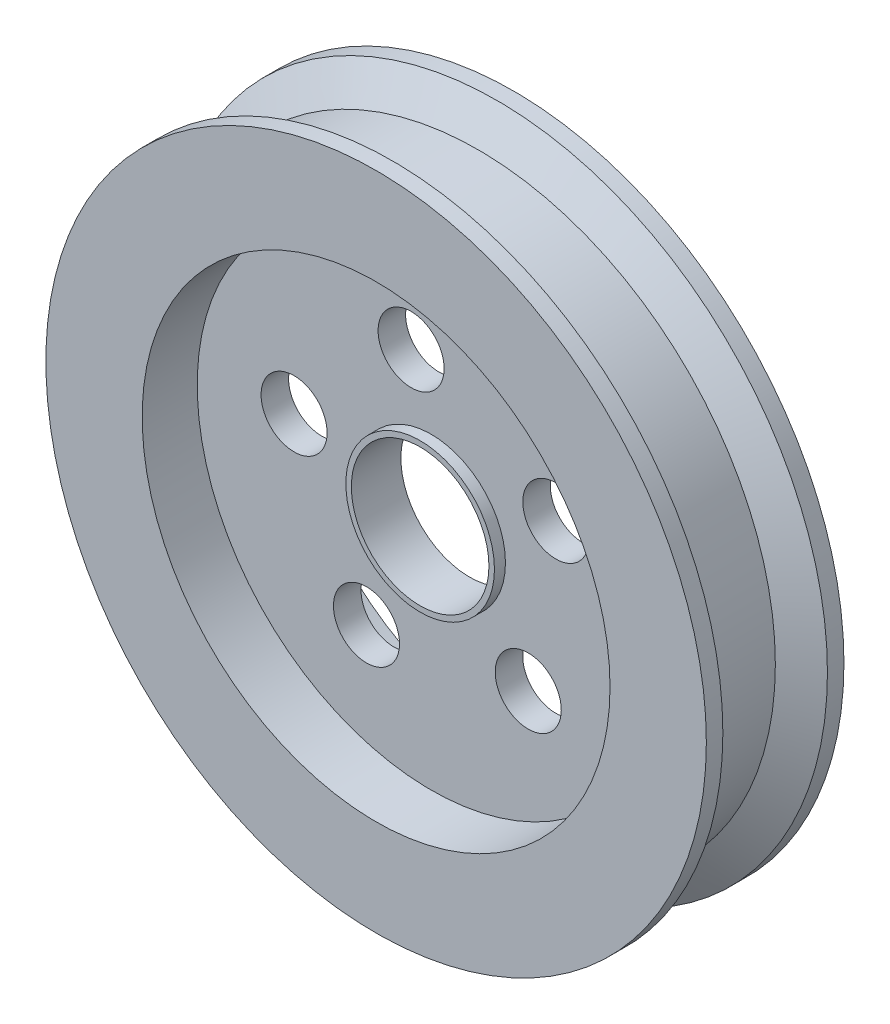
ISO-10303-21;
HEADER;
FILE_DESCRIPTION(('STEP AP214'),'2;1');
FILE_NAME('part.step','',(''),(''),'','','');
FILE_SCHEMA(('AUTOMOTIVE_DESIGN { 1 0 10303 214 1 1 1 1 }'));
ENDSEC;
DATA;
#1=APPLICATION_CONTEXT('core data for automotive mechanical design processes');
#2=APPLICATION_PROTOCOL_DEFINITION('international standard','automotive_design',2000,#1);
#3=PRODUCT_CONTEXT('',#1,'mechanical');
#4=PRODUCT('Part','Part','',(#3));
#5=PRODUCT_RELATED_PRODUCT_CATEGORY('part','',(#4));
#6=PRODUCT_DEFINITION_FORMATION('','',#4);
#7=PRODUCT_DEFINITION_CONTEXT('part definition',#1,'design');
#8=PRODUCT_DEFINITION('design','',#6,#7);
#9=PRODUCT_DEFINITION_SHAPE('','',#8);
#10=(LENGTH_UNIT() NAMED_UNIT(*) SI_UNIT(.MILLI.,.METRE.));
#11=(NAMED_UNIT(*) PLANE_ANGLE_UNIT() SI_UNIT($,.RADIAN.));
#12=(NAMED_UNIT(*) SI_UNIT($,.STERADIAN.) SOLID_ANGLE_UNIT());
#13=UNCERTAINTY_MEASURE_WITH_UNIT(LENGTH_MEASURE(1.E-05),#10,'distance_accuracy_value','');
#14=(GEOMETRIC_REPRESENTATION_CONTEXT(3) GLOBAL_UNCERTAINTY_ASSIGNED_CONTEXT((#13)) GLOBAL_UNIT_ASSIGNED_CONTEXT((#10,
#11,#12)) REPRESENTATION_CONTEXT('',''));
#15=CARTESIAN_POINT('',(0.,0.,0.));
#16=DIRECTION('',(0.,0.,1.));
#17=DIRECTION('',(1.,0.,0.));
#18=AXIS2_PLACEMENT_3D('',#15,#16,#17);
#19=CARTESIAN_POINT('',(0.,0.,12.5));
#20=DIRECTION('',(0.,0.,-1.));
#21=DIRECTION('',(-1.,0.,0.));
#22=AXIS2_PLACEMENT_3D('',#19,#20,#21);
#23=CYLINDRICAL_SURFACE('',#22,60.);
#24=CARTESIAN_POINT('',(0.,0.,-12.5));
#25=DIRECTION('',(0.,0.,1.));
#26=DIRECTION('',(1.,0.,0.));
#27=AXIS2_PLACEMENT_3D('',#24,#25,#26);
#28=CIRCLE('',#27,60.);
#29=CARTESIAN_POINT('',(60.,0.,-12.5));
#30=VERTEX_POINT('',#29);
#31=EDGE_CURVE('E89',#30,#30,#28,.T.);
#32=ORIENTED_EDGE('',*,*,#31,.T.);
#33=EDGE_LOOP('',(#32));
#34=FACE_BOUND('',#33,.T.);
#35=CARTESIAN_POINT('',(0.,0.,-9.5));
#36=DIRECTION('',(0.,0.,1.));
#37=DIRECTION('',(1.,0.,0.));
#38=AXIS2_PLACEMENT_3D('',#35,#36,#37);
#39=CIRCLE('',#38,60.);
#40=CARTESIAN_POINT('',(60.,0.,-9.5));
#41=VERTEX_POINT('',#40);
#42=EDGE_CURVE('E56',#41,#41,#39,.T.);
#43=ORIENTED_EDGE('',*,*,#42,.F.);
#44=EDGE_LOOP('',(#43));
#45=FACE_BOUND('',#44,.T.);
#46=ADVANCED_FACE('F31',(#34,#45),#23,.T.);
#47=CARTESIAN_POINT('',(0.,0.,12.5));
#48=DIRECTION('',(0.,0.,1.));
#49=DIRECTION('',(1.,0.,0.));
#50=AXIS2_PLACEMENT_3D('',#47,#48,#49);
#51=CIRCLE('',#50,60.);
#52=CARTESIAN_POINT('',(60.,0.,12.5));
#53=VERTEX_POINT('',#52);
#54=EDGE_CURVE('E42',#53,#53,#51,.T.);
#55=ORIENTED_EDGE('',*,*,#54,.F.);
#56=EDGE_LOOP('',(#55));
#57=FACE_BOUND('',#56,.T.);
#58=CARTESIAN_POINT('',(0.,0.,9.5));
#59=DIRECTION('',(0.,0.,1.));
#60=DIRECTION('',(1.,0.,0.));
#61=AXIS2_PLACEMENT_3D('',#58,#59,#60);
#62=CIRCLE('',#61,60.);
#63=CARTESIAN_POINT('',(60.,0.,9.5));
#64=VERTEX_POINT('',#63);
#65=EDGE_CURVE('E47',#64,#64,#62,.T.);
#66=ORIENTED_EDGE('',*,*,#65,.T.);
#67=EDGE_LOOP('',(#66));
#68=FACE_BOUND('',#67,.T.);
#69=ADVANCED_FACE('F135',(#57,#68),#23,.T.);
#70=CARTESIAN_POINT('',(0.,0.,-12.5));
#71=DIRECTION('',(0.,0.,1.));
#72=DIRECTION('',(1.,0.,0.));
#73=AXIS2_PLACEMENT_3D('',#70,#71,#72);
#74=PLANE('',#73);
#75=ORIENTED_EDGE('',*,*,#31,.F.);
#76=EDGE_LOOP('',(#75));
#77=FACE_BOUND('',#76,.T.);
#78=CARTESIAN_POINT('',(0.,0.,-12.5));
#79=DIRECTION('',(0.,0.,1.));
#80=DIRECTION('',(1.,0.,0.));
#81=AXIS2_PLACEMENT_3D('',#78,#79,#80);
#82=CIRCLE('',#81,42.5);
#83=CARTESIAN_POINT('',(42.5,0.,-12.5));
#84=VERTEX_POINT('',#83);
#85=EDGE_CURVE('E83',#84,#84,#82,.T.);
#86=ORIENTED_EDGE('',*,*,#85,.T.);
#87=EDGE_LOOP('',(#86));
#88=FACE_BOUND('',#87,.T.);
#89=ADVANCED_FACE('F132',(#77,#88),#74,.F.);
#90=CARTESIAN_POINT('',(0.,0.,12.5));
#91=DIRECTION('',(0.,0.,1.));
#92=DIRECTION('',(1.,0.,0.));
#93=AXIS2_PLACEMENT_3D('',#90,#91,#92);
#94=PLANE('',#93);
#95=CARTESIAN_POINT('',(0.,0.,12.5));
#96=DIRECTION('',(0.,0.,1.));
#97=DIRECTION('',(1.,0.,0.));
#98=AXIS2_PLACEMENT_3D('',#95,#96,#97);
#99=CIRCLE('',#98,42.5);
#100=CARTESIAN_POINT('',(42.5,0.,12.5));
#101=VERTEX_POINT('',#100);
#102=EDGE_CURVE('E82',#101,#101,#99,.T.);
#103=ORIENTED_EDGE('',*,*,#102,.F.);
#104=EDGE_LOOP('',(#103));
#105=FACE_BOUND('',#104,.T.);
#106=ORIENTED_EDGE('',*,*,#54,.T.);
#107=EDGE_LOOP('',(#106));
#108=FACE_BOUND('',#107,.T.);
#109=ADVANCED_FACE('F134',(#105,#108),#94,.T.);
#110=CARTESIAN_POINT('',(0.,0.,2.5));
#111=DIRECTION('',(0.,0.,1.));
#112=DIRECTION('',(1.,0.,0.));
#113=AXIS2_PLACEMENT_3D('',#110,#111,#112);
#114=CYLINDRICAL_SURFACE('',#113,42.5);
#115=CARTESIAN_POINT('',(0.,0.,2.5));
#116=DIRECTION('',(0.,0.,1.));
#117=DIRECTION('',(1.,0.,0.));
#118=AXIS2_PLACEMENT_3D('',#115,#116,#117);
#119=CIRCLE('',#118,42.5);
#120=CARTESIAN_POINT('',(42.5,0.,2.5));
#121=VERTEX_POINT('',#120);
#122=EDGE_CURVE('E86',#121,#121,#119,.T.);
#123=ORIENTED_EDGE('',*,*,#122,.F.);
#124=EDGE_LOOP('',(#123));
#125=FACE_BOUND('',#124,.T.);
#126=ORIENTED_EDGE('',*,*,#102,.T.);
#127=EDGE_LOOP('',(#126));
#128=FACE_BOUND('',#127,.T.);
#129=ADVANCED_FACE('F141',(#125,#128),#114,.F.);
#130=CARTESIAN_POINT('',(0.,0.,2.5));
#131=DIRECTION('',(0.,0.,1.));
#132=DIRECTION('',(1.,0.,0.));
#133=AXIS2_PLACEMENT_3D('',#130,#131,#132);
#134=PLANE('',#133);
#135=CARTESIAN_POINT('',(0.,0.,2.5));
#136=DIRECTION('',(0.,0.,1.));
#137=DIRECTION('',(1.,0.,0.));
#138=AXIS2_PLACEMENT_3D('',#135,#136,#137);
#139=CIRCLE('',#138,13.5);
#140=CARTESIAN_POINT('',(13.5,0.,2.5));
#141=VERTEX_POINT('',#140);
#142=EDGE_CURVE('E10',#141,#141,#139,.T.);
#143=ORIENTED_EDGE('',*,*,#142,.F.);
#144=EDGE_LOOP('',(#143));
#145=FACE_BOUND('',#144,.T.);
#146=CARTESIAN_POINT('',(22.6517749592965,11.186704557469,2.5));
#147=DIRECTION('',(0.,0.,1.));
#148=DIRECTION('',(0.309016994374958,-0.95105651629515,0.));
#149=AXIS2_PLACEMENT_3D('',#146,#147,#148);
#150=CIRCLE('',#149,6.);
#151=CARTESIAN_POINT('',(28.6517749592965,11.186704557469,2.5));
#152=VERTEX_POINT('',#151);
#153=EDGE_CURVE('E59',#152,#152,#150,.T.);
#154=ORIENTED_EDGE('',*,*,#153,.F.);
#155=EDGE_LOOP('',(#154));
#156=FACE_BOUND('',#155,.T.);
#157=CARTESIAN_POINT('',(17.638971680429,-18.0862363613808,2.5));
#158=DIRECTION('',(0.,0.,1.));
#159=DIRECTION('',(-0.809016994374942,-0.58778525229248,0.));
#160=AXIS2_PLACEMENT_3D('',#157,#158,#159);
#161=CIRCLE('',#160,6.);
#162=CARTESIAN_POINT('',(23.638971680429,-18.0862363613808,2.5));
#163=VERTEX_POINT('',#162);
#164=EDGE_CURVE('E63',#163,#163,#161,.T.);
#165=ORIENTED_EDGE('',*,*,#164,.F.);
#166=EDGE_LOOP('',(#165));
#167=FACE_BOUND('',#166,.T.);
#168=CARTESIAN_POINT('',(-11.7502909341946,-22.3646133573665,2.5));
#169=DIRECTION('',(0.,0.,1.));
#170=DIRECTION('',(-0.809016994374951,0.587785252292469,0.));
#171=AXIS2_PLACEMENT_3D('',#168,#169,#170);
#172=CIRCLE('',#171,6.);
#173=CARTESIAN_POINT('',(-5.75029093419464,-22.3646133573665,2.5));
#174=VERTEX_POINT('',#173);
#175=EDGE_CURVE('E67',#174,#174,#172,.T.);
#176=ORIENTED_EDGE('',*,*,#175,.F.);
#177=EDGE_LOOP('',(#176));
#178=FACE_BOUND('',#177,.T.);
#179=CARTESIAN_POINT('',(-24.901050855461,4.26414516127857,2.5));
#180=DIRECTION('',(0.,0.,1.));
#181=DIRECTION('',(0.309016994374945,0.951056516295155,0.));
#182=AXIS2_PLACEMENT_3D('',#179,#180,#181);
#183=CIRCLE('',#182,6.);
#184=CARTESIAN_POINT('',(-18.901050855461,4.26414516127857,2.5));
#185=VERTEX_POINT('',#184);
#186=EDGE_CURVE('E71',#185,#185,#183,.T.);
#187=ORIENTED_EDGE('',*,*,#186,.F.);
#188=EDGE_LOOP('',(#187));
#189=FACE_BOUND('',#188,.T.);
#190=CARTESIAN_POINT('',(-3.63940485006978,25.,2.5));
#191=DIRECTION('',(0.,0.,1.));
#192=DIRECTION('',(1.,0.,0.));
#193=AXIS2_PLACEMENT_3D('',#190,#191,#192);
#194=CIRCLE('',#193,6.);
#195=CARTESIAN_POINT('',(2.36059514993022,25.,2.5));
#196=VERTEX_POINT('',#195);
#197=EDGE_CURVE('E75',#196,#196,#194,.T.);
#198=ORIENTED_EDGE('',*,*,#197,.F.);
#199=EDGE_LOOP('',(#198));
#200=FACE_BOUND('',#199,.T.);
#201=ORIENTED_EDGE('',*,*,#122,.T.);
#202=EDGE_LOOP('',(#201));
#203=FACE_BOUND('',#202,.T.);
#204=ADVANCED_FACE('F128',(#145,#156,#167,#178,#189,#200,#203),#134,.T.);
#205=CARTESIAN_POINT('',(0.,0.,-2.5));
#206=DIRECTION('',(0.,0.,-1.));
#207=DIRECTION('',(-1.,0.,0.));
#208=AXIS2_PLACEMENT_3D('',#205,#206,#207);
#209=CYLINDRICAL_SURFACE('',#208,42.5);
#210=CARTESIAN_POINT('',(0.,0.,-2.5));
#211=DIRECTION('',(0.,0.,1.));
#212=DIRECTION('',(1.,0.,0.));
#213=AXIS2_PLACEMENT_3D('',#210,#211,#212);
#214=CIRCLE('',#213,42.5);
#215=CARTESIAN_POINT('',(42.5,0.,-2.5));
#216=VERTEX_POINT('',#215);
#217=EDGE_CURVE('E79',#216,#216,#214,.T.);
#218=ORIENTED_EDGE('',*,*,#217,.T.);
#219=EDGE_LOOP('',(#218));
#220=FACE_BOUND('',#219,.T.);
#221=ORIENTED_EDGE('',*,*,#85,.F.);
#222=EDGE_LOOP('',(#221));
#223=FACE_BOUND('',#222,.T.);
#224=ADVANCED_FACE('F113',(#220,#223),#209,.F.);
#225=CARTESIAN_POINT('',(0.,0.,-2.5));
#226=DIRECTION('',(0.,0.,-1.));
#227=DIRECTION('',(1.,0.,0.));
#228=AXIS2_PLACEMENT_3D('',#225,#226,#227);
#229=PLANE('',#228);
#230=CARTESIAN_POINT('',(0.,0.,-2.5));
#231=DIRECTION('',(0.,0.,-1.));
#232=DIRECTION('',(-1.,0.,0.));
#233=AXIS2_PLACEMENT_3D('',#230,#231,#232);
#234=CIRCLE('',#233,13.5);
#235=CARTESIAN_POINT('',(-13.5,0.,-2.5));
#236=VERTEX_POINT('',#235);
#237=EDGE_CURVE('E34',#236,#236,#234,.T.);
#238=ORIENTED_EDGE('',*,*,#237,.F.);
#239=EDGE_LOOP('',(#238));
#240=FACE_BOUND('',#239,.T.);
#241=CARTESIAN_POINT('',(22.6517749592965,11.186704557469,-2.5));
#242=DIRECTION('',(0.,0.,-1.));
#243=DIRECTION('',(-1.,0.,0.));
#244=AXIS2_PLACEMENT_3D('',#241,#242,#243);
#245=CIRCLE('',#244,6.);
#246=CARTESIAN_POINT('',(28.6517749592965,11.186704557469,-2.5));
#247=VERTEX_POINT('',#246);
#248=EDGE_CURVE('E62',#247,#247,#245,.T.);
#249=ORIENTED_EDGE('',*,*,#248,.F.);
#250=EDGE_LOOP('',(#249));
#251=FACE_BOUND('',#250,.T.);
#252=CARTESIAN_POINT('',(17.638971680429,-18.0862363613808,-2.5));
#253=DIRECTION('',(0.,0.,-1.));
#254=DIRECTION('',(-1.,0.,0.));
#255=AXIS2_PLACEMENT_3D('',#252,#253,#254);
#256=CIRCLE('',#255,6.);
#257=CARTESIAN_POINT('',(23.638971680429,-18.0862363613808,-2.5));
#258=VERTEX_POINT('',#257);
#259=EDGE_CURVE('E66',#258,#258,#256,.T.);
#260=ORIENTED_EDGE('',*,*,#259,.F.);
#261=EDGE_LOOP('',(#260));
#262=FACE_BOUND('',#261,.T.);
#263=CARTESIAN_POINT('',(-11.7502909341946,-22.3646133573665,-2.5));
#264=DIRECTION('',(0.,0.,-1.));
#265=DIRECTION('',(-1.,0.,0.));
#266=AXIS2_PLACEMENT_3D('',#263,#264,#265);
#267=CIRCLE('',#266,6.);
#268=CARTESIAN_POINT('',(-5.75029093419464,-22.3646133573665,-2.5));
#269=VERTEX_POINT('',#268);
#270=EDGE_CURVE('E70',#269,#269,#267,.T.);
#271=ORIENTED_EDGE('',*,*,#270,.F.);
#272=EDGE_LOOP('',(#271));
#273=FACE_BOUND('',#272,.T.);
#274=CARTESIAN_POINT('',(-24.901050855461,4.26414516127857,-2.5));
#275=DIRECTION('',(0.,0.,-1.));
#276=DIRECTION('',(-1.,0.,0.));
#277=AXIS2_PLACEMENT_3D('',#274,#275,#276);
#278=CIRCLE('',#277,6.);
#279=CARTESIAN_POINT('',(-18.901050855461,4.26414516127857,-2.5));
#280=VERTEX_POINT('',#279);
#281=EDGE_CURVE('E74',#280,#280,#278,.T.);
#282=ORIENTED_EDGE('',*,*,#281,.F.);
#283=EDGE_LOOP('',(#282));
#284=FACE_BOUND('',#283,.T.);
#285=CARTESIAN_POINT('',(-3.63940485006978,25.,-2.5));
#286=DIRECTION('',(0.,0.,-1.));
#287=DIRECTION('',(-1.,0.,0.));
#288=AXIS2_PLACEMENT_3D('',#285,#286,#287);
#289=CIRCLE('',#288,6.);
#290=CARTESIAN_POINT('',(2.36059514993022,25.,-2.5));
#291=VERTEX_POINT('',#290);
#292=EDGE_CURVE('E78',#291,#291,#289,.T.);
#293=ORIENTED_EDGE('',*,*,#292,.F.);
#294=EDGE_LOOP('',(#293));
#295=FACE_BOUND('',#294,.T.);
#296=ORIENTED_EDGE('',*,*,#217,.F.);
#297=EDGE_LOOP('',(#296));
#298=FACE_BOUND('',#297,.T.);
#299=ADVANCED_FACE('F109',(#240,#251,#262,#273,#284,#295,#298),#229,.T.);
#300=CARTESIAN_POINT('',(-3.63940485006978,25.,-12.5));
#301=DIRECTION('',(0.,0.,1.));
#302=DIRECTION('',(1.,0.,0.));
#303=AXIS2_PLACEMENT_3D('',#300,#301,#302);
#304=CYLINDRICAL_SURFACE('',#303,6.);
#305=CARTESIAN_POINT('',(2.36059514993022,25.,-2.5));
#306=CARTESIAN_POINT('',(2.36059514993022,25.,-2.44791666666667));
#307=CARTESIAN_POINT('',(2.36059514993022,25.,-2.39583333333333));
#308=CARTESIAN_POINT('',(2.36059514993022,25.,-2.29166666666667));
#309=CARTESIAN_POINT('',(2.36059514993022,25.,-2.23958333333333));
#310=CARTESIAN_POINT('',(2.36059514993022,25.,-2.13541666666667));
#311=CARTESIAN_POINT('',(2.36059514993022,25.,-2.08333333333333));
#312=CARTESIAN_POINT('',(2.36059514993022,25.,-1.97916666666667));
#313=CARTESIAN_POINT('',(2.36059514993022,25.,-1.92708333333333));
#314=CARTESIAN_POINT('',(2.36059514993022,25.,-1.82291666666667));
#315=CARTESIAN_POINT('',(2.36059514993022,25.,-1.77083333333333));
#316=CARTESIAN_POINT('',(2.36059514993022,25.,-1.66666666666667));
#317=CARTESIAN_POINT('',(2.36059514993022,25.,-1.61458333333333));
#318=CARTESIAN_POINT('',(2.36059514993022,25.,-1.51041666666667));
#319=CARTESIAN_POINT('',(2.36059514993022,25.,-1.45833333333333));
#320=CARTESIAN_POINT('',(2.36059514993022,25.,-1.35416666666667));
#321=CARTESIAN_POINT('',(2.36059514993022,25.,-1.30208333333333));
#322=CARTESIAN_POINT('',(2.36059514993022,25.,-1.19791666666667));
#323=CARTESIAN_POINT('',(2.36059514993022,25.,-1.14583333333333));
#324=CARTESIAN_POINT('',(2.36059514993022,25.,-1.04166666666667));
#325=CARTESIAN_POINT('',(2.36059514993022,25.,-0.989583333333334));
#326=CARTESIAN_POINT('',(2.36059514993022,25.,-0.885416666666668));
#327=CARTESIAN_POINT('',(2.36059514993022,25.,-0.833333333333334));
#328=CARTESIAN_POINT('',(2.36059514993022,25.,-0.729166666666667));
#329=CARTESIAN_POINT('',(2.36059514993022,25.,-0.677083333333334));
#330=CARTESIAN_POINT('',(2.36059514993022,25.,-0.572916666666667));
#331=CARTESIAN_POINT('',(2.36059514993022,25.,-0.520833333333334));
#332=CARTESIAN_POINT('',(2.36059514993022,25.,-0.416666666666667));
#333=CARTESIAN_POINT('',(2.36059514993022,25.,-0.364583333333334));
#334=CARTESIAN_POINT('',(2.36059514993022,25.,-0.260416666666667));
#335=CARTESIAN_POINT('',(2.36059514993022,25.,-0.208333333333334));
#336=CARTESIAN_POINT('',(2.36059514993022,25.,-0.104166666666667));
#337=CARTESIAN_POINT('',(2.36059514993022,25.,-0.0520833333333334));
#338=CARTESIAN_POINT('',(2.36059514993022,25.,0.0520833333333334));
#339=CARTESIAN_POINT('',(2.36059514993022,25.,0.104166666666667));
#340=CARTESIAN_POINT('',(2.36059514993022,25.,0.208333333333334));
#341=CARTESIAN_POINT('',(2.36059514993022,25.,0.260416666666667));
#342=CARTESIAN_POINT('',(2.36059514993022,25.,0.364583333333334));
#343=CARTESIAN_POINT('',(2.36059514993022,25.,0.416666666666667));
#344=CARTESIAN_POINT('',(2.36059514993022,25.,0.520833333333334));
#345=CARTESIAN_POINT('',(2.36059514993022,25.,0.572916666666667));
#346=CARTESIAN_POINT('',(2.36059514993022,25.,0.677083333333334));
#347=CARTESIAN_POINT('',(2.36059514993022,25.,0.729166666666667));
#348=CARTESIAN_POINT('',(2.36059514993022,25.,0.833333333333333));
#349=CARTESIAN_POINT('',(2.36059514993022,25.,0.885416666666666));
#350=CARTESIAN_POINT('',(2.36059514993022,25.,0.989583333333333));
#351=CARTESIAN_POINT('',(2.36059514993022,25.,1.04166666666667));
#352=CARTESIAN_POINT('',(2.36059514993022,25.,1.14583333333333));
#353=CARTESIAN_POINT('',(2.36059514993022,25.,1.19791666666667));
#354=CARTESIAN_POINT('',(2.36059514993022,25.,1.30208333333333));
#355=CARTESIAN_POINT('',(2.36059514993022,25.,1.35416666666667));
#356=CARTESIAN_POINT('',(2.36059514993022,25.,1.45833333333333));
#357=CARTESIAN_POINT('',(2.36059514993022,25.,1.51041666666667));
#358=CARTESIAN_POINT('',(2.36059514993022,25.,1.61458333333333));
#359=CARTESIAN_POINT('',(2.36059514993022,25.,1.66666666666667));
#360=CARTESIAN_POINT('',(2.36059514993022,25.,1.77083333333333));
#361=CARTESIAN_POINT('',(2.36059514993022,25.,1.82291666666667));
#362=CARTESIAN_POINT('',(2.36059514993022,25.,1.92708333333333));
#363=CARTESIAN_POINT('',(2.36059514993022,25.,1.97916666666667));
#364=CARTESIAN_POINT('',(2.36059514993022,25.,2.08333333333333));
#365=CARTESIAN_POINT('',(2.36059514993022,25.,2.13541666666667));
#366=CARTESIAN_POINT('',(2.36059514993022,25.,2.23958333333333));
#367=CARTESIAN_POINT('',(2.36059514993022,25.,2.29166666666667));
#368=CARTESIAN_POINT('',(2.36059514993022,25.,2.39583333333333));
#369=CARTESIAN_POINT('',(2.36059514993022,25.,2.44791666666667));
#370=CARTESIAN_POINT('',(2.36059514993022,25.,2.5));
#371=B_SPLINE_CURVE_WITH_KNOTS('',3,(#305,#306,#307,#308,#309,#310,#311,#312,#313,#314,#315,
#316,#317,#318,#319,#320,#321,#322,#323,#324,#325,#326,#327,#328,#329,#330,#331,#332,#333,#334,
#335,#336,#337,#338,#339,#340,#341,#342,#343,#344,#345,#346,#347,#348,#349,#350,#351,#352,#353,
#354,#355,#356,#357,#358,#359,#360,#361,#362,#363,#364,#365,#366,#367,#368,#369,#370),
.UNSPECIFIED.,.F.,.F.,(4,2,2,2,2,2,2,2,2,2,2,2,2,2,2,2,2,2,2,2,2,2,2,2,2,2,2,2,2,2,2,2,4),(0.,
0.15625,0.3125,0.46875,0.625000000000001,0.781250000000001,0.937500000000001,1.09375,1.25,
1.40625,1.5625,1.71875,1.875,2.03125,2.1875,2.34375,2.5,2.65625,2.8125,2.96875,3.125,3.28125,
3.4375,3.59375,3.75,3.90625,4.0625,4.21875,4.375,4.53125,4.6875,4.84375,5.),.UNSPECIFIED.);
#372=EDGE_CURVE('BSEAM112',#291,#196,#371,.T.);
#373=ORIENTED_EDGE('',*,*,#292,.T.);
#374=ORIENTED_EDGE('',*,*,#197,.T.);
#375=ORIENTED_EDGE('',*,*,#372,.T.);
#376=ORIENTED_EDGE('',*,*,#372,.F.);
#377=EDGE_LOOP('',(#373,#375,#374,#376));
#378=FACE_BOUND('',#377,.T.);
#379=ADVANCED_FACE('F112',(#378),#304,.F.);
#380=CARTESIAN_POINT('',(-24.901050855461,4.26414516127857,-12.5));
#381=DIRECTION('',(0.,0.,1.));
#382=DIRECTION('',(1.,0.,0.));
#383=AXIS2_PLACEMENT_3D('',#380,#381,#382);
#384=CYLINDRICAL_SURFACE('',#383,6.);
#385=CARTESIAN_POINT('',(-18.901050855461,4.26414516127857,-2.5));
#386=CARTESIAN_POINT('',(-18.901050855461,4.26414516127857,-2.44791666666667));
#387=CARTESIAN_POINT('',(-18.901050855461,4.26414516127857,-2.39583333333333));
#388=CARTESIAN_POINT('',(-18.901050855461,4.26414516127857,-2.29166666666667));
#389=CARTESIAN_POINT('',(-18.901050855461,4.26414516127857,-2.23958333333333));
#390=CARTESIAN_POINT('',(-18.901050855461,4.26414516127857,-2.13541666666667));
#391=CARTESIAN_POINT('',(-18.901050855461,4.26414516127857,-2.08333333333333));
#392=CARTESIAN_POINT('',(-18.901050855461,4.26414516127857,-1.97916666666667));
#393=CARTESIAN_POINT('',(-18.901050855461,4.26414516127857,-1.92708333333333));
#394=CARTESIAN_POINT('',(-18.901050855461,4.26414516127857,-1.82291666666667));
#395=CARTESIAN_POINT('',(-18.901050855461,4.26414516127857,-1.77083333333333));
#396=CARTESIAN_POINT('',(-18.901050855461,4.26414516127857,-1.66666666666667));
#397=CARTESIAN_POINT('',(-18.901050855461,4.26414516127857,-1.61458333333333));
#398=CARTESIAN_POINT('',(-18.901050855461,4.26414516127857,-1.51041666666667));
#399=CARTESIAN_POINT('',(-18.901050855461,4.26414516127857,-1.45833333333333));
#400=CARTESIAN_POINT('',(-18.901050855461,4.26414516127857,-1.35416666666667));
#401=CARTESIAN_POINT('',(-18.901050855461,4.26414516127857,-1.30208333333333));
#402=CARTESIAN_POINT('',(-18.901050855461,4.26414516127857,-1.19791666666667));
#403=CARTESIAN_POINT('',(-18.901050855461,4.26414516127857,-1.14583333333333));
#404=CARTESIAN_POINT('',(-18.901050855461,4.26414516127857,-1.04166666666667));
#405=CARTESIAN_POINT('',(-18.901050855461,4.26414516127857,-0.989583333333334));
#406=CARTESIAN_POINT('',(-18.901050855461,4.26414516127857,-0.885416666666668));
#407=CARTESIAN_POINT('',(-18.901050855461,4.26414516127857,-0.833333333333334));
#408=CARTESIAN_POINT('',(-18.901050855461,4.26414516127857,-0.729166666666667));
#409=CARTESIAN_POINT('',(-18.901050855461,4.26414516127857,-0.677083333333334));
#410=CARTESIAN_POINT('',(-18.901050855461,4.26414516127857,-0.572916666666667));
#411=CARTESIAN_POINT('',(-18.901050855461,4.26414516127857,-0.520833333333334));
#412=CARTESIAN_POINT('',(-18.901050855461,4.26414516127857,-0.416666666666667));
#413=CARTESIAN_POINT('',(-18.901050855461,4.26414516127857,-0.364583333333334));
#414=CARTESIAN_POINT('',(-18.901050855461,4.26414516127857,-0.260416666666667));
#415=CARTESIAN_POINT('',(-18.901050855461,4.26414516127857,-0.208333333333334));
#416=CARTESIAN_POINT('',(-18.901050855461,4.26414516127857,-0.104166666666667));
#417=CARTESIAN_POINT('',(-18.901050855461,4.26414516127857,-0.0520833333333334));
#418=CARTESIAN_POINT('',(-18.901050855461,4.26414516127857,0.0520833333333334));
#419=CARTESIAN_POINT('',(-18.901050855461,4.26414516127857,0.104166666666667));
#420=CARTESIAN_POINT('',(-18.901050855461,4.26414516127857,0.208333333333334));
#421=CARTESIAN_POINT('',(-18.901050855461,4.26414516127857,0.260416666666667));
#422=CARTESIAN_POINT('',(-18.901050855461,4.26414516127857,0.364583333333334));
#423=CARTESIAN_POINT('',(-18.901050855461,4.26414516127857,0.416666666666667));
#424=CARTESIAN_POINT('',(-18.901050855461,4.26414516127857,0.520833333333334));
#425=CARTESIAN_POINT('',(-18.901050855461,4.26414516127857,0.572916666666667));
#426=CARTESIAN_POINT('',(-18.901050855461,4.26414516127857,0.677083333333334));
#427=CARTESIAN_POINT('',(-18.901050855461,4.26414516127857,0.729166666666667));
#428=CARTESIAN_POINT('',(-18.901050855461,4.26414516127857,0.833333333333333));
#429=CARTESIAN_POINT('',(-18.901050855461,4.26414516127857,0.885416666666666));
#430=CARTESIAN_POINT('',(-18.901050855461,4.26414516127857,0.989583333333333));
#431=CARTESIAN_POINT('',(-18.901050855461,4.26414516127857,1.04166666666667));
#432=CARTESIAN_POINT('',(-18.901050855461,4.26414516127857,1.14583333333333));
#433=CARTESIAN_POINT('',(-18.901050855461,4.26414516127857,1.19791666666667));
#434=CARTESIAN_POINT('',(-18.901050855461,4.26414516127857,1.30208333333333));
#435=CARTESIAN_POINT('',(-18.901050855461,4.26414516127857,1.35416666666667));
#436=CARTESIAN_POINT('',(-18.901050855461,4.26414516127857,1.45833333333333));
#437=CARTESIAN_POINT('',(-18.901050855461,4.26414516127857,1.51041666666667));
#438=CARTESIAN_POINT('',(-18.901050855461,4.26414516127857,1.61458333333333));
#439=CARTESIAN_POINT('',(-18.901050855461,4.26414516127857,1.66666666666667));
#440=CARTESIAN_POINT('',(-18.901050855461,4.26414516127857,1.77083333333333));
#441=CARTESIAN_POINT('',(-18.901050855461,4.26414516127857,1.82291666666667));
#442=CARTESIAN_POINT('',(-18.901050855461,4.26414516127857,1.92708333333333));
#443=CARTESIAN_POINT('',(-18.901050855461,4.26414516127857,1.97916666666667));
#444=CARTESIAN_POINT('',(-18.901050855461,4.26414516127857,2.08333333333333));
#445=CARTESIAN_POINT('',(-18.901050855461,4.26414516127857,2.13541666666667));
#446=CARTESIAN_POINT('',(-18.901050855461,4.26414516127857,2.23958333333333));
#447=CARTESIAN_POINT('',(-18.901050855461,4.26414516127857,2.29166666666667));
#448=CARTESIAN_POINT('',(-18.901050855461,4.26414516127857,2.39583333333333));
#449=CARTESIAN_POINT('',(-18.901050855461,4.26414516127857,2.44791666666667));
#450=CARTESIAN_POINT('',(-18.901050855461,4.26414516127857,2.5));
#451=B_SPLINE_CURVE_WITH_KNOTS('',3,(#385,#386,#387,#388,#389,#390,#391,#392,#393,#394,#395,
#396,#397,#398,#399,#400,#401,#402,#403,#404,#405,#406,#407,#408,#409,#410,#411,#412,#413,#414,
#415,#416,#417,#418,#419,#420,#421,#422,#423,#424,#425,#426,#427,#428,#429,#430,#431,#432,#433,
#434,#435,#436,#437,#438,#439,#440,#441,#442,#443,#444,#445,#446,#447,#448,#449,#450),
.UNSPECIFIED.,.F.,.F.,(4,2,2,2,2,2,2,2,2,2,2,2,2,2,2,2,2,2,2,2,2,2,2,2,2,2,2,2,2,2,2,2,4),(0.,
0.15625,0.3125,0.46875,0.625000000000001,0.781250000000001,0.937500000000001,1.09375,1.25,
1.40625,1.5625,1.71875,1.875,2.03125,2.1875,2.34375,2.5,2.65625,2.8125,2.96875,3.125,3.28125,
3.4375,3.59375,3.75,3.90625,4.0625,4.21875,4.375,4.53125,4.6875,4.84375,5.),.UNSPECIFIED.);
#452=EDGE_CURVE('BSEAM190',#280,#185,#451,.T.);
#453=ORIENTED_EDGE('',*,*,#281,.T.);
#454=ORIENTED_EDGE('',*,*,#186,.T.);
#455=ORIENTED_EDGE('',*,*,#452,.T.);
#456=ORIENTED_EDGE('',*,*,#452,.F.);
#457=EDGE_LOOP('',(#453,#455,#454,#456));
#458=FACE_BOUND('',#457,.T.);
#459=ADVANCED_FACE('F190',(#458),#384,.F.);
#460=CARTESIAN_POINT('',(-11.7502909341946,-22.3646133573665,-12.5));
#461=DIRECTION('',(0.,0.,1.));
#462=DIRECTION('',(1.,0.,0.));
#463=AXIS2_PLACEMENT_3D('',#460,#461,#462);
#464=CYLINDRICAL_SURFACE('',#463,6.);
#465=CARTESIAN_POINT('',(-5.75029093419464,-22.3646133573665,-2.5));
#466=CARTESIAN_POINT('',(-5.75029093419464,-22.3646133573665,-2.44791666666667));
#467=CARTESIAN_POINT('',(-5.75029093419464,-22.3646133573665,-2.39583333333333));
#468=CARTESIAN_POINT('',(-5.75029093419464,-22.3646133573665,-2.29166666666667));
#469=CARTESIAN_POINT('',(-5.75029093419464,-22.3646133573665,-2.23958333333333));
#470=CARTESIAN_POINT('',(-5.75029093419464,-22.3646133573665,-2.13541666666667));
#471=CARTESIAN_POINT('',(-5.75029093419464,-22.3646133573665,-2.08333333333333));
#472=CARTESIAN_POINT('',(-5.75029093419464,-22.3646133573665,-1.97916666666667));
#473=CARTESIAN_POINT('',(-5.75029093419464,-22.3646133573665,-1.92708333333333));
#474=CARTESIAN_POINT('',(-5.75029093419464,-22.3646133573665,-1.82291666666667));
#475=CARTESIAN_POINT('',(-5.75029093419464,-22.3646133573665,-1.77083333333333));
#476=CARTESIAN_POINT('',(-5.75029093419464,-22.3646133573665,-1.66666666666667));
#477=CARTESIAN_POINT('',(-5.75029093419464,-22.3646133573665,-1.61458333333333));
#478=CARTESIAN_POINT('',(-5.75029093419464,-22.3646133573665,-1.51041666666667));
#479=CARTESIAN_POINT('',(-5.75029093419464,-22.3646133573665,-1.45833333333333));
#480=CARTESIAN_POINT('',(-5.75029093419464,-22.3646133573665,-1.35416666666667));
#481=CARTESIAN_POINT('',(-5.75029093419464,-22.3646133573665,-1.30208333333333));
#482=CARTESIAN_POINT('',(-5.75029093419464,-22.3646133573665,-1.19791666666667));
#483=CARTESIAN_POINT('',(-5.75029093419464,-22.3646133573665,-1.14583333333333));
#484=CARTESIAN_POINT('',(-5.75029093419464,-22.3646133573665,-1.04166666666667));
#485=CARTESIAN_POINT('',(-5.75029093419464,-22.3646133573665,-0.989583333333334));
#486=CARTESIAN_POINT('',(-5.75029093419464,-22.3646133573665,-0.885416666666668));
#487=CARTESIAN_POINT('',(-5.75029093419464,-22.3646133573665,-0.833333333333334));
#488=CARTESIAN_POINT('',(-5.75029093419464,-22.3646133573665,-0.729166666666667));
#489=CARTESIAN_POINT('',(-5.75029093419464,-22.3646133573665,-0.677083333333334));
#490=CARTESIAN_POINT('',(-5.75029093419464,-22.3646133573665,-0.572916666666667));
#491=CARTESIAN_POINT('',(-5.75029093419464,-22.3646133573665,-0.520833333333334));
#492=CARTESIAN_POINT('',(-5.75029093419464,-22.3646133573665,-0.416666666666667));
#493=CARTESIAN_POINT('',(-5.75029093419464,-22.3646133573665,-0.364583333333334));
#494=CARTESIAN_POINT('',(-5.75029093419464,-22.3646133573665,-0.260416666666667));
#495=CARTESIAN_POINT('',(-5.75029093419464,-22.3646133573665,-0.208333333333334));
#496=CARTESIAN_POINT('',(-5.75029093419464,-22.3646133573665,-0.104166666666667));
#497=CARTESIAN_POINT('',(-5.75029093419464,-22.3646133573665,-0.0520833333333334));
#498=CARTESIAN_POINT('',(-5.75029093419464,-22.3646133573665,0.0520833333333334));
#499=CARTESIAN_POINT('',(-5.75029093419464,-22.3646133573665,0.104166666666667));
#500=CARTESIAN_POINT('',(-5.75029093419464,-22.3646133573665,0.208333333333334));
#501=CARTESIAN_POINT('',(-5.75029093419464,-22.3646133573665,0.260416666666667));
#502=CARTESIAN_POINT('',(-5.75029093419464,-22.3646133573665,0.364583333333334));
#503=CARTESIAN_POINT('',(-5.75029093419464,-22.3646133573665,0.416666666666667));
#504=CARTESIAN_POINT('',(-5.75029093419464,-22.3646133573665,0.520833333333334));
#505=CARTESIAN_POINT('',(-5.75029093419464,-22.3646133573665,0.572916666666667));
#506=CARTESIAN_POINT('',(-5.75029093419464,-22.3646133573665,0.677083333333334));
#507=CARTESIAN_POINT('',(-5.75029093419464,-22.3646133573665,0.729166666666667));
#508=CARTESIAN_POINT('',(-5.75029093419464,-22.3646133573665,0.833333333333333));
#509=CARTESIAN_POINT('',(-5.75029093419464,-22.3646133573665,0.885416666666666));
#510=CARTESIAN_POINT('',(-5.75029093419464,-22.3646133573665,0.989583333333333));
#511=CARTESIAN_POINT('',(-5.75029093419464,-22.3646133573665,1.04166666666667));
#512=CARTESIAN_POINT('',(-5.75029093419464,-22.3646133573665,1.14583333333333));
#513=CARTESIAN_POINT('',(-5.75029093419464,-22.3646133573665,1.19791666666667));
#514=CARTESIAN_POINT('',(-5.75029093419464,-22.3646133573665,1.30208333333333));
#515=CARTESIAN_POINT('',(-5.75029093419464,-22.3646133573665,1.35416666666667));
#516=CARTESIAN_POINT('',(-5.75029093419464,-22.3646133573665,1.45833333333333));
#517=CARTESIAN_POINT('',(-5.75029093419464,-22.3646133573665,1.51041666666667));
#518=CARTESIAN_POINT('',(-5.75029093419464,-22.3646133573665,1.61458333333333));
#519=CARTESIAN_POINT('',(-5.75029093419464,-22.3646133573665,1.66666666666667));
#520=CARTESIAN_POINT('',(-5.75029093419464,-22.3646133573665,1.77083333333333));
#521=CARTESIAN_POINT('',(-5.75029093419464,-22.3646133573665,1.82291666666667));
#522=CARTESIAN_POINT('',(-5.75029093419464,-22.3646133573665,1.92708333333333));
#523=CARTESIAN_POINT('',(-5.75029093419464,-22.3646133573665,1.97916666666667));
#524=CARTESIAN_POINT('',(-5.75029093419464,-22.3646133573665,2.08333333333333));
#525=CARTESIAN_POINT('',(-5.75029093419464,-22.3646133573665,2.13541666666667));
#526=CARTESIAN_POINT('',(-5.75029093419464,-22.3646133573665,2.23958333333333));
#527=CARTESIAN_POINT('',(-5.75029093419464,-22.3646133573665,2.29166666666667));
#528=CARTESIAN_POINT('',(-5.75029093419464,-22.3646133573665,2.39583333333333));
#529=CARTESIAN_POINT('',(-5.75029093419464,-22.3646133573665,2.44791666666667));
#530=CARTESIAN_POINT('',(-5.75029093419464,-22.3646133573665,2.5));
#531=B_SPLINE_CURVE_WITH_KNOTS('',3,(#465,#466,#467,#468,#469,#470,#471,#472,#473,#474,#475,
#476,#477,#478,#479,#480,#481,#482,#483,#484,#485,#486,#487,#488,#489,#490,#491,#492,#493,#494,
#495,#496,#497,#498,#499,#500,#501,#502,#503,#504,#505,#506,#507,#508,#509,#510,#511,#512,#513,
#514,#515,#516,#517,#518,#519,#520,#521,#522,#523,#524,#525,#526,#527,#528,#529,#530),
.UNSPECIFIED.,.F.,.F.,(4,2,2,2,2,2,2,2,2,2,2,2,2,2,2,2,2,2,2,2,2,2,2,2,2,2,2,2,2,2,2,2,4),(0.,
0.15625,0.3125,0.46875,0.625000000000001,0.781250000000001,0.937500000000001,1.09375,1.25,
1.40625,1.5625,1.71875,1.875,2.03125,2.1875,2.34375,2.5,2.65625,2.8125,2.96875,3.125,3.28125,
3.4375,3.59375,3.75,3.90625,4.0625,4.21875,4.375,4.53125,4.6875,4.84375,5.),.UNSPECIFIED.);
#532=EDGE_CURVE('BSEAM186',#269,#174,#531,.T.);
#533=ORIENTED_EDGE('',*,*,#270,.T.);
#534=ORIENTED_EDGE('',*,*,#175,.T.);
#535=ORIENTED_EDGE('',*,*,#532,.T.);
#536=ORIENTED_EDGE('',*,*,#532,.F.);
#537=EDGE_LOOP('',(#533,#535,#534,#536));
#538=FACE_BOUND('',#537,.T.);
#539=ADVANCED_FACE('F186',(#538),#464,.F.);
#540=CARTESIAN_POINT('',(17.638971680429,-18.0862363613808,-12.5));
#541=DIRECTION('',(0.,0.,1.));
#542=DIRECTION('',(1.,0.,0.));
#543=AXIS2_PLACEMENT_3D('',#540,#541,#542);
#544=CYLINDRICAL_SURFACE('',#543,6.);
#545=CARTESIAN_POINT('',(23.638971680429,-18.0862363613808,-2.5));
#546=CARTESIAN_POINT('',(23.638971680429,-18.0862363613808,-2.44791666666667));
#547=CARTESIAN_POINT('',(23.638971680429,-18.0862363613808,-2.39583333333333));
#548=CARTESIAN_POINT('',(23.638971680429,-18.0862363613808,-2.29166666666667));
#549=CARTESIAN_POINT('',(23.638971680429,-18.0862363613808,-2.23958333333333));
#550=CARTESIAN_POINT('',(23.638971680429,-18.0862363613808,-2.13541666666667));
#551=CARTESIAN_POINT('',(23.638971680429,-18.0862363613808,-2.08333333333333));
#552=CARTESIAN_POINT('',(23.638971680429,-18.0862363613808,-1.97916666666667));
#553=CARTESIAN_POINT('',(23.638971680429,-18.0862363613808,-1.92708333333333));
#554=CARTESIAN_POINT('',(23.638971680429,-18.0862363613808,-1.82291666666667));
#555=CARTESIAN_POINT('',(23.638971680429,-18.0862363613808,-1.77083333333333));
#556=CARTESIAN_POINT('',(23.638971680429,-18.0862363613808,-1.66666666666667));
#557=CARTESIAN_POINT('',(23.638971680429,-18.0862363613808,-1.61458333333333));
#558=CARTESIAN_POINT('',(23.638971680429,-18.0862363613808,-1.51041666666667));
#559=CARTESIAN_POINT('',(23.638971680429,-18.0862363613808,-1.45833333333333));
#560=CARTESIAN_POINT('',(23.638971680429,-18.0862363613808,-1.35416666666667));
#561=CARTESIAN_POINT('',(23.638971680429,-18.0862363613808,-1.30208333333333));
#562=CARTESIAN_POINT('',(23.638971680429,-18.0862363613808,-1.19791666666667));
#563=CARTESIAN_POINT('',(23.638971680429,-18.0862363613808,-1.14583333333333));
#564=CARTESIAN_POINT('',(23.638971680429,-18.0862363613808,-1.04166666666667));
#565=CARTESIAN_POINT('',(23.638971680429,-18.0862363613808,-0.989583333333334));
#566=CARTESIAN_POINT('',(23.638971680429,-18.0862363613808,-0.885416666666668));
#567=CARTESIAN_POINT('',(23.638971680429,-18.0862363613808,-0.833333333333334));
#568=CARTESIAN_POINT('',(23.638971680429,-18.0862363613808,-0.729166666666667));
#569=CARTESIAN_POINT('',(23.638971680429,-18.0862363613808,-0.677083333333334));
#570=CARTESIAN_POINT('',(23.638971680429,-18.0862363613808,-0.572916666666667));
#571=CARTESIAN_POINT('',(23.638971680429,-18.0862363613808,-0.520833333333334));
#572=CARTESIAN_POINT('',(23.638971680429,-18.0862363613808,-0.416666666666667));
#573=CARTESIAN_POINT('',(23.638971680429,-18.0862363613808,-0.364583333333334));
#574=CARTESIAN_POINT('',(23.638971680429,-18.0862363613808,-0.260416666666667));
#575=CARTESIAN_POINT('',(23.638971680429,-18.0862363613808,-0.208333333333334));
#576=CARTESIAN_POINT('',(23.638971680429,-18.0862363613808,-0.104166666666667));
#577=CARTESIAN_POINT('',(23.638971680429,-18.0862363613808,-0.0520833333333334));
#578=CARTESIAN_POINT('',(23.638971680429,-18.0862363613808,0.0520833333333334));
#579=CARTESIAN_POINT('',(23.638971680429,-18.0862363613808,0.104166666666667));
#580=CARTESIAN_POINT('',(23.638971680429,-18.0862363613808,0.208333333333334));
#581=CARTESIAN_POINT('',(23.638971680429,-18.0862363613808,0.260416666666667));
#582=CARTESIAN_POINT('',(23.638971680429,-18.0862363613808,0.364583333333334));
#583=CARTESIAN_POINT('',(23.638971680429,-18.0862363613808,0.416666666666667));
#584=CARTESIAN_POINT('',(23.638971680429,-18.0862363613808,0.520833333333334));
#585=CARTESIAN_POINT('',(23.638971680429,-18.0862363613808,0.572916666666667));
#586=CARTESIAN_POINT('',(23.638971680429,-18.0862363613808,0.677083333333334));
#587=CARTESIAN_POINT('',(23.638971680429,-18.0862363613808,0.729166666666667));
#588=CARTESIAN_POINT('',(23.638971680429,-18.0862363613808,0.833333333333333));
#589=CARTESIAN_POINT('',(23.638971680429,-18.0862363613808,0.885416666666666));
#590=CARTESIAN_POINT('',(23.638971680429,-18.0862363613808,0.989583333333333));
#591=CARTESIAN_POINT('',(23.638971680429,-18.0862363613808,1.04166666666667));
#592=CARTESIAN_POINT('',(23.638971680429,-18.0862363613808,1.14583333333333));
#593=CARTESIAN_POINT('',(23.638971680429,-18.0862363613808,1.19791666666667));
#594=CARTESIAN_POINT('',(23.638971680429,-18.0862363613808,1.30208333333333));
#595=CARTESIAN_POINT('',(23.638971680429,-18.0862363613808,1.35416666666667));
#596=CARTESIAN_POINT('',(23.638971680429,-18.0862363613808,1.45833333333333));
#597=CARTESIAN_POINT('',(23.638971680429,-18.0862363613808,1.51041666666667));
#598=CARTESIAN_POINT('',(23.638971680429,-18.0862363613808,1.61458333333333));
#599=CARTESIAN_POINT('',(23.638971680429,-18.0862363613808,1.66666666666667));
#600=CARTESIAN_POINT('',(23.638971680429,-18.0862363613808,1.77083333333333));
#601=CARTESIAN_POINT('',(23.638971680429,-18.0862363613808,1.82291666666667));
#602=CARTESIAN_POINT('',(23.638971680429,-18.0862363613808,1.92708333333333));
#603=CARTESIAN_POINT('',(23.638971680429,-18.0862363613808,1.97916666666667));
#604=CARTESIAN_POINT('',(23.638971680429,-18.0862363613808,2.08333333333333));
#605=CARTESIAN_POINT('',(23.638971680429,-18.0862363613808,2.13541666666667));
#606=CARTESIAN_POINT('',(23.638971680429,-18.0862363613808,2.23958333333333));
#607=CARTESIAN_POINT('',(23.638971680429,-18.0862363613808,2.29166666666667));
#608=CARTESIAN_POINT('',(23.638971680429,-18.0862363613808,2.39583333333333));
#609=CARTESIAN_POINT('',(23.638971680429,-18.0862363613808,2.44791666666667));
#610=CARTESIAN_POINT('',(23.638971680429,-18.0862363613808,2.5));
#611=B_SPLINE_CURVE_WITH_KNOTS('',3,(#545,#546,#547,#548,#549,#550,#551,#552,#553,#554,#555,
#556,#557,#558,#559,#560,#561,#562,#563,#564,#565,#566,#567,#568,#569,#570,#571,#572,#573,#574,
#575,#576,#577,#578,#579,#580,#581,#582,#583,#584,#585,#586,#587,#588,#589,#590,#591,#592,#593,
#594,#595,#596,#597,#598,#599,#600,#601,#602,#603,#604,#605,#606,#607,#608,#609,#610),
.UNSPECIFIED.,.F.,.F.,(4,2,2,2,2,2,2,2,2,2,2,2,2,2,2,2,2,2,2,2,2,2,2,2,2,2,2,2,2,2,2,2,4),(0.,
0.15625,0.3125,0.46875,0.625000000000001,0.781250000000001,0.937500000000001,1.09375,1.25,
1.40625,1.5625,1.71875,1.875,2.03125,2.1875,2.34375,2.5,2.65625,2.8125,2.96875,3.125,3.28125,
3.4375,3.59375,3.75,3.90625,4.0625,4.21875,4.375,4.53125,4.6875,4.84375,5.),.UNSPECIFIED.);
#612=EDGE_CURVE('BSEAM183',#258,#163,#611,.T.);
#613=ORIENTED_EDGE('',*,*,#259,.T.);
#614=ORIENTED_EDGE('',*,*,#164,.T.);
#615=ORIENTED_EDGE('',*,*,#612,.T.);
#616=ORIENTED_EDGE('',*,*,#612,.F.);
#617=EDGE_LOOP('',(#613,#615,#614,#616));
#618=FACE_BOUND('',#617,.T.);
#619=ADVANCED_FACE('F183',(#618),#544,.F.);
#620=CARTESIAN_POINT('',(22.6517749592965,11.186704557469,-12.5));
#621=DIRECTION('',(0.,0.,1.));
#622=DIRECTION('',(1.,0.,0.));
#623=AXIS2_PLACEMENT_3D('',#620,#621,#622);
#624=CYLINDRICAL_SURFACE('',#623,6.);
#625=CARTESIAN_POINT('',(28.6517749592965,11.186704557469,-2.5));
#626=CARTESIAN_POINT('',(28.6517749592965,11.186704557469,-2.44791666666667));
#627=CARTESIAN_POINT('',(28.6517749592965,11.186704557469,-2.39583333333333));
#628=CARTESIAN_POINT('',(28.6517749592965,11.186704557469,-2.29166666666667));
#629=CARTESIAN_POINT('',(28.6517749592965,11.186704557469,-2.23958333333333));
#630=CARTESIAN_POINT('',(28.6517749592965,11.186704557469,-2.13541666666667));
#631=CARTESIAN_POINT('',(28.6517749592965,11.186704557469,-2.08333333333333));
#632=CARTESIAN_POINT('',(28.6517749592965,11.186704557469,-1.97916666666667));
#633=CARTESIAN_POINT('',(28.6517749592965,11.186704557469,-1.92708333333333));
#634=CARTESIAN_POINT('',(28.6517749592965,11.186704557469,-1.82291666666667));
#635=CARTESIAN_POINT('',(28.6517749592965,11.186704557469,-1.77083333333333));
#636=CARTESIAN_POINT('',(28.6517749592965,11.186704557469,-1.66666666666667));
#637=CARTESIAN_POINT('',(28.6517749592965,11.186704557469,-1.61458333333333));
#638=CARTESIAN_POINT('',(28.6517749592965,11.186704557469,-1.51041666666667));
#639=CARTESIAN_POINT('',(28.6517749592965,11.186704557469,-1.45833333333333));
#640=CARTESIAN_POINT('',(28.6517749592965,11.186704557469,-1.35416666666667));
#641=CARTESIAN_POINT('',(28.6517749592965,11.186704557469,-1.30208333333333));
#642=CARTESIAN_POINT('',(28.6517749592965,11.186704557469,-1.19791666666667));
#643=CARTESIAN_POINT('',(28.6517749592965,11.186704557469,-1.14583333333333));
#644=CARTESIAN_POINT('',(28.6517749592965,11.186704557469,-1.04166666666667));
#645=CARTESIAN_POINT('',(28.6517749592965,11.186704557469,-0.989583333333334));
#646=CARTESIAN_POINT('',(28.6517749592965,11.186704557469,-0.885416666666668));
#647=CARTESIAN_POINT('',(28.6517749592965,11.186704557469,-0.833333333333334));
#648=CARTESIAN_POINT('',(28.6517749592965,11.186704557469,-0.729166666666667));
#649=CARTESIAN_POINT('',(28.6517749592965,11.186704557469,-0.677083333333334));
#650=CARTESIAN_POINT('',(28.6517749592965,11.186704557469,-0.572916666666667));
#651=CARTESIAN_POINT('',(28.6517749592965,11.186704557469,-0.520833333333334));
#652=CARTESIAN_POINT('',(28.6517749592965,11.186704557469,-0.416666666666667));
#653=CARTESIAN_POINT('',(28.6517749592965,11.186704557469,-0.364583333333334));
#654=CARTESIAN_POINT('',(28.6517749592965,11.186704557469,-0.260416666666667));
#655=CARTESIAN_POINT('',(28.6517749592965,11.186704557469,-0.208333333333334));
#656=CARTESIAN_POINT('',(28.6517749592965,11.186704557469,-0.104166666666667));
#657=CARTESIAN_POINT('',(28.6517749592965,11.186704557469,-0.0520833333333334));
#658=CARTESIAN_POINT('',(28.6517749592965,11.186704557469,0.0520833333333334));
#659=CARTESIAN_POINT('',(28.6517749592965,11.186704557469,0.104166666666667));
#660=CARTESIAN_POINT('',(28.6517749592965,11.186704557469,0.208333333333334));
#661=CARTESIAN_POINT('',(28.6517749592965,11.186704557469,0.260416666666667));
#662=CARTESIAN_POINT('',(28.6517749592965,11.186704557469,0.364583333333334));
#663=CARTESIAN_POINT('',(28.6517749592965,11.186704557469,0.416666666666667));
#664=CARTESIAN_POINT('',(28.6517749592965,11.186704557469,0.520833333333334));
#665=CARTESIAN_POINT('',(28.6517749592965,11.186704557469,0.572916666666667));
#666=CARTESIAN_POINT('',(28.6517749592965,11.186704557469,0.677083333333334));
#667=CARTESIAN_POINT('',(28.6517749592965,11.186704557469,0.729166666666667));
#668=CARTESIAN_POINT('',(28.6517749592965,11.186704557469,0.833333333333333));
#669=CARTESIAN_POINT('',(28.6517749592965,11.186704557469,0.885416666666666));
#670=CARTESIAN_POINT('',(28.6517749592965,11.186704557469,0.989583333333333));
#671=CARTESIAN_POINT('',(28.6517749592965,11.186704557469,1.04166666666667));
#672=CARTESIAN_POINT('',(28.6517749592965,11.186704557469,1.14583333333333));
#673=CARTESIAN_POINT('',(28.6517749592965,11.186704557469,1.19791666666667));
#674=CARTESIAN_POINT('',(28.6517749592965,11.186704557469,1.30208333333333));
#675=CARTESIAN_POINT('',(28.6517749592965,11.186704557469,1.35416666666667));
#676=CARTESIAN_POINT('',(28.6517749592965,11.186704557469,1.45833333333333));
#677=CARTESIAN_POINT('',(28.6517749592965,11.186704557469,1.51041666666667));
#678=CARTESIAN_POINT('',(28.6517749592965,11.186704557469,1.61458333333333));
#679=CARTESIAN_POINT('',(28.6517749592965,11.186704557469,1.66666666666667));
#680=CARTESIAN_POINT('',(28.6517749592965,11.186704557469,1.77083333333333));
#681=CARTESIAN_POINT('',(28.6517749592965,11.186704557469,1.82291666666667));
#682=CARTESIAN_POINT('',(28.6517749592965,11.186704557469,1.92708333333333));
#683=CARTESIAN_POINT('',(28.6517749592965,11.186704557469,1.97916666666667));
#684=CARTESIAN_POINT('',(28.6517749592965,11.186704557469,2.08333333333333));
#685=CARTESIAN_POINT('',(28.6517749592965,11.186704557469,2.13541666666667));
#686=CARTESIAN_POINT('',(28.6517749592965,11.186704557469,2.23958333333333));
#687=CARTESIAN_POINT('',(28.6517749592965,11.186704557469,2.29166666666667));
#688=CARTESIAN_POINT('',(28.6517749592965,11.186704557469,2.39583333333333));
#689=CARTESIAN_POINT('',(28.6517749592965,11.186704557469,2.44791666666667));
#690=CARTESIAN_POINT('',(28.6517749592965,11.186704557469,2.5));
#691=B_SPLINE_CURVE_WITH_KNOTS('',3,(#625,#626,#627,#628,#629,#630,#631,#632,#633,#634,#635,
#636,#637,#638,#639,#640,#641,#642,#643,#644,#645,#646,#647,#648,#649,#650,#651,#652,#653,#654,
#655,#656,#657,#658,#659,#660,#661,#662,#663,#664,#665,#666,#667,#668,#669,#670,#671,#672,#673,
#674,#675,#676,#677,#678,#679,#680,#681,#682,#683,#684,#685,#686,#687,#688,#689,#690),
.UNSPECIFIED.,.F.,.F.,(4,2,2,2,2,2,2,2,2,2,2,2,2,2,2,2,2,2,2,2,2,2,2,2,2,2,2,2,2,2,2,2,4),(0.,
0.15625,0.3125,0.46875,0.625000000000001,0.781250000000001,0.937500000000001,1.09375,1.25,
1.40625,1.5625,1.71875,1.875,2.03125,2.1875,2.34375,2.5,2.65625,2.8125,2.96875,3.125,3.28125,
3.4375,3.59375,3.75,3.90625,4.0625,4.21875,4.375,4.53125,4.6875,4.84375,5.),.UNSPECIFIED.);
#692=EDGE_CURVE('BSEAM106',#247,#152,#691,.T.);
#693=ORIENTED_EDGE('',*,*,#248,.T.);
#694=ORIENTED_EDGE('',*,*,#153,.T.);
#695=ORIENTED_EDGE('',*,*,#692,.T.);
#696=ORIENTED_EDGE('',*,*,#692,.F.);
#697=EDGE_LOOP('',(#693,#695,#694,#696));
#698=FACE_BOUND('',#697,.T.);
#699=ADVANCED_FACE('F106',(#698),#624,.F.);
#700=CARTESIAN_POINT('',(0.,0.,-6.03589838486221));
#701=DIRECTION('',(0.,0.,-1.));
#702=DIRECTION('',(-1.,0.,0.));
#703=AXIS2_PLACEMENT_3D('',#700,#701,#702);
#704=CONICAL_SURFACE('',#703,54.,1.04719755119659);
#705=ORIENTED_EDGE('',*,*,#42,.T.);
#706=EDGE_LOOP('',(#705));
#707=FACE_BOUND('',#706,.T.);
#708=CARTESIAN_POINT('',(0.,0.,-6.03589838486221));
#709=DIRECTION('',(0.,0.,1.));
#710=DIRECTION('',(1.,0.,0.));
#711=AXIS2_PLACEMENT_3D('',#708,#709,#710);
#712=CIRCLE('',#711,54.);
#713=CARTESIAN_POINT('',(54.,0.,-6.03589838486221));
#714=VERTEX_POINT('',#713);
#715=EDGE_CURVE('E53',#714,#714,#712,.T.);
#716=ORIENTED_EDGE('',*,*,#715,.F.);
#717=EDGE_LOOP('',(#716));
#718=FACE_BOUND('',#717,.T.);
#719=ADVANCED_FACE('F153',(#707,#718),#704,.T.);
#720=CARTESIAN_POINT('',(0.,0.,0.));
#721=DIRECTION('',(0.,0.,1.));
#722=DIRECTION('',(1.,0.,0.));
#723=AXIS2_PLACEMENT_3D('',#720,#721,#722);
#724=CYLINDRICAL_SURFACE('',#723,54.);
#725=ORIENTED_EDGE('',*,*,#715,.T.);
#726=EDGE_LOOP('',(#725));
#727=FACE_BOUND('',#726,.T.);
#728=CARTESIAN_POINT('',(0.,0.,6.03589838486221));
#729=DIRECTION('',(0.,0.,1.));
#730=DIRECTION('',(1.,0.,0.));
#731=AXIS2_PLACEMENT_3D('',#728,#729,#730);
#732=CIRCLE('',#731,54.);
#733=CARTESIAN_POINT('',(54.,0.,6.03589838486221));
#734=VERTEX_POINT('',#733);
#735=EDGE_CURVE('E50',#734,#734,#732,.T.);
#736=ORIENTED_EDGE('',*,*,#735,.F.);
#737=EDGE_LOOP('',(#736));
#738=FACE_BOUND('',#737,.T.);
#739=ADVANCED_FACE('F156',(#727,#738),#724,.T.);
#740=CARTESIAN_POINT('',(0.,0.,9.5));
#741=DIRECTION('',(0.,0.,1.));
#742=DIRECTION('',(1.,0.,0.));
#743=AXIS2_PLACEMENT_3D('',#740,#741,#742);
#744=CONICAL_SURFACE('',#743,60.,1.04719755119659);
#745=ORIENTED_EDGE('',*,*,#735,.T.);
#746=EDGE_LOOP('',(#745));
#747=FACE_BOUND('',#746,.T.);
#748=ORIENTED_EDGE('',*,*,#65,.F.);
#749=EDGE_LOOP('',(#748));
#750=FACE_BOUND('',#749,.T.);
#751=ADVANCED_FACE('F162',(#747,#750),#744,.T.);
#752=CARTESIAN_POINT('',(0.,0.,-4.5));
#753=DIRECTION('',(0.,0.,1.));
#754=DIRECTION('',(1.,0.,0.));
#755=AXIS2_PLACEMENT_3D('',#752,#753,#754);
#756=CYLINDRICAL_SURFACE('',#755,13.5);
#757=ORIENTED_EDGE('',*,*,#237,.T.);
#758=EDGE_LOOP('',(#757));
#759=FACE_BOUND('',#758,.T.);
#760=CARTESIAN_POINT('',(0.,0.,-4.5));
#761=DIRECTION('',(0.,0.,1.));
#762=DIRECTION('',(1.,0.,0.));
#763=AXIS2_PLACEMENT_3D('',#760,#761,#762);
#764=CIRCLE('',#763,13.5);
#765=CARTESIAN_POINT('',(13.5,0.,-4.5));
#766=VERTEX_POINT('',#765);
#767=EDGE_CURVE('E45',#766,#766,#764,.T.);
#768=ORIENTED_EDGE('',*,*,#767,.T.);
#769=EDGE_LOOP('',(#768));
#770=FACE_BOUND('',#769,.T.);
#771=ADVANCED_FACE('F168',(#759,#770),#756,.T.);
#772=CARTESIAN_POINT('',(0.,0.,-4.5));
#773=DIRECTION('',(0.,0.,1.));
#774=DIRECTION('',(1.,0.,0.));
#775=AXIS2_PLACEMENT_3D('',#772,#773,#774);
#776=PLANE('',#775);
#777=CARTESIAN_POINT('',(0.,0.,-4.5));
#778=DIRECTION('',(0.,0.,1.));
#779=DIRECTION('',(1.,0.,0.));
#780=AXIS2_PLACEMENT_3D('',#777,#778,#779);
#781=CIRCLE('',#780,12.5);
#782=CARTESIAN_POINT('',(12.5,0.,-4.5));
#783=VERTEX_POINT('',#782);
#784=EDGE_CURVE('E216',#783,#783,#781,.T.);
#785=ORIENTED_EDGE('',*,*,#784,.T.);
#786=EDGE_LOOP('',(#785));
#787=FACE_BOUND('',#786,.T.);
#788=ORIENTED_EDGE('',*,*,#767,.F.);
#789=EDGE_LOOP('',(#788));
#790=FACE_BOUND('',#789,.T.);
#791=ADVANCED_FACE('F175',(#787,#790),#776,.F.);
#792=ORIENTED_EDGE('',*,*,#142,.T.);
#793=EDGE_LOOP('',(#792));
#794=FACE_BOUND('',#793,.T.);
#795=CARTESIAN_POINT('',(0.,0.,4.5));
#796=DIRECTION('',(0.,0.,1.));
#797=DIRECTION('',(1.,0.,0.));
#798=AXIS2_PLACEMENT_3D('',#795,#796,#797);
#799=CIRCLE('',#798,13.5);
#800=CARTESIAN_POINT('',(13.5,0.,4.5));
#801=VERTEX_POINT('',#800);
#802=EDGE_CURVE('E221',#801,#801,#799,.T.);
#803=ORIENTED_EDGE('',*,*,#802,.F.);
#804=EDGE_LOOP('',(#803));
#805=FACE_BOUND('',#804,.T.);
#806=ADVANCED_FACE('F178',(#794,#805),#756,.T.);
#807=CARTESIAN_POINT('',(0.,0.,4.5));
#808=DIRECTION('',(0.,0.,1.));
#809=DIRECTION('',(1.,0.,0.));
#810=AXIS2_PLACEMENT_3D('',#807,#808,#809);
#811=PLANE('',#810);
#812=ORIENTED_EDGE('',*,*,#802,.T.);
#813=EDGE_LOOP('',(#812));
#814=FACE_BOUND('',#813,.T.);
#815=CARTESIAN_POINT('',(0.,0.,4.5));
#816=DIRECTION('',(0.,0.,1.));
#817=DIRECTION('',(1.,0.,0.));
#818=AXIS2_PLACEMENT_3D('',#815,#816,#817);
#819=CIRCLE('',#818,12.5);
#820=CARTESIAN_POINT('',(12.5,0.,4.5));
#821=VERTEX_POINT('',#820);
#822=EDGE_CURVE('E219',#821,#821,#819,.T.);
#823=ORIENTED_EDGE('',*,*,#822,.F.);
#824=EDGE_LOOP('',(#823));
#825=FACE_BOUND('',#824,.T.);
#826=ADVANCED_FACE('F206',(#814,#825),#811,.T.);
#827=CARTESIAN_POINT('',(0.,0.,12.5));
#828=DIRECTION('',(0.,0.,-1.));
#829=DIRECTION('',(-1.,0.,0.));
#830=AXIS2_PLACEMENT_3D('',#827,#828,#829);
#831=CYLINDRICAL_SURFACE('',#830,12.5);
#832=ORIENTED_EDGE('',*,*,#784,.F.);
#833=EDGE_LOOP('',(#832));
#834=FACE_BOUND('',#833,.T.);
#835=ORIENTED_EDGE('',*,*,#822,.T.);
#836=EDGE_LOOP('',(#835));
#837=FACE_BOUND('',#836,.T.);
#838=ADVANCED_FACE('F204',(#834,#837),#831,.F.);
#839=CLOSED_SHELL('',(#46,#69,#89,#109,#129,#204,#224,#299,#379,#459,#539,#619,#699,#719,#739,
#751,#771,#791,#806,#826,#838));
#840=MANIFOLD_SOLID_BREP('B2',#839);
#841=ADVANCED_BREP_SHAPE_REPRESENTATION('',(#18,#840),#14);
#842=SHAPE_DEFINITION_REPRESENTATION(#9,#841);
ENDSEC;
END-ISO-10303-21;
